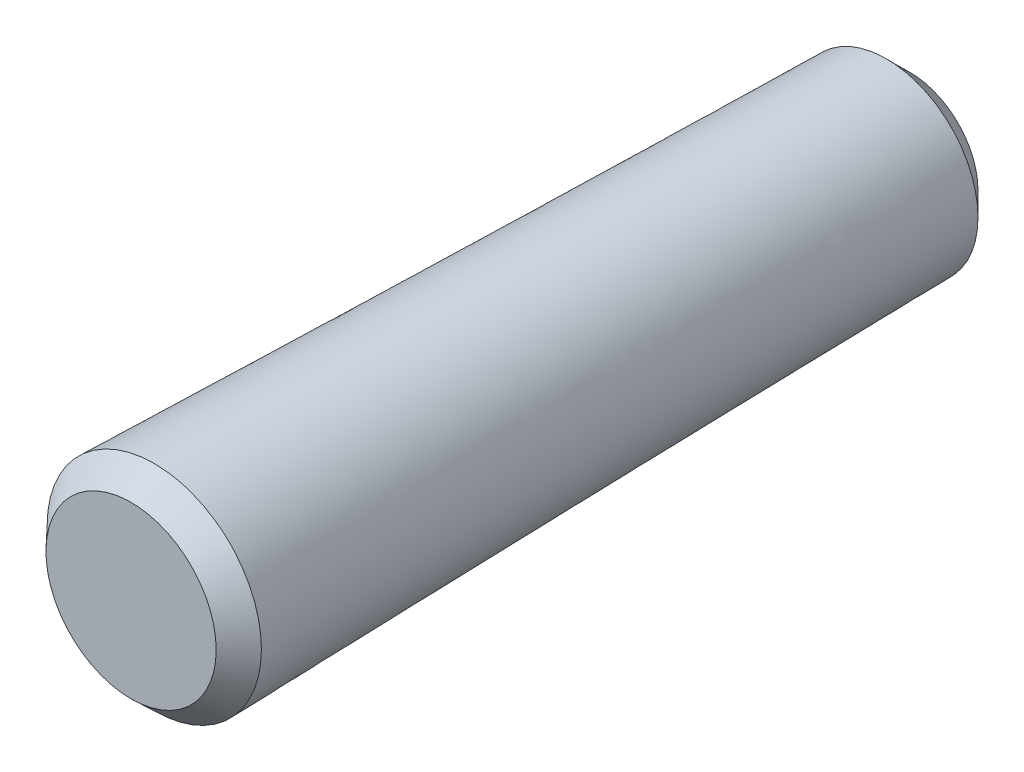
ISO-10303-21;
HEADER;
FILE_DESCRIPTION(('STEP AP214'),'2;1');
FILE_NAME('part.step','',(''),(''),'','','');
FILE_SCHEMA(('AUTOMOTIVE_DESIGN { 1 0 10303 214 1 1 1 1 }'));
ENDSEC;
DATA;
#1=APPLICATION_CONTEXT('core data for automotive mechanical design processes');
#2=APPLICATION_PROTOCOL_DEFINITION('international standard','automotive_design',2000,#1);
#3=PRODUCT_CONTEXT('',#1,'mechanical');
#4=PRODUCT('Part','Part','',(#3));
#5=PRODUCT_RELATED_PRODUCT_CATEGORY('part','',(#4));
#6=PRODUCT_DEFINITION_FORMATION('','',#4);
#7=PRODUCT_DEFINITION_CONTEXT('part definition',#1,'design');
#8=PRODUCT_DEFINITION('design','',#6,#7);
#9=PRODUCT_DEFINITION_SHAPE('','',#8);
#10=(LENGTH_UNIT() NAMED_UNIT(*) SI_UNIT(.MILLI.,.METRE.));
#11=(NAMED_UNIT(*) PLANE_ANGLE_UNIT() SI_UNIT($,.RADIAN.));
#12=(NAMED_UNIT(*) SI_UNIT($,.STERADIAN.) SOLID_ANGLE_UNIT());
#13=UNCERTAINTY_MEASURE_WITH_UNIT(LENGTH_MEASURE(1.E-05),#10,'distance_accuracy_value','');
#14=(GEOMETRIC_REPRESENTATION_CONTEXT(3) GLOBAL_UNCERTAINTY_ASSIGNED_CONTEXT((#13)) GLOBAL_UNIT_ASSIGNED_CONTEXT((#10,
#11,#12)) REPRESENTATION_CONTEXT('',''));
#15=CARTESIAN_POINT('',(0.,0.,0.));
#16=DIRECTION('',(0.,0.,1.));
#17=DIRECTION('',(1.,0.,0.));
#18=AXIS2_PLACEMENT_3D('',#15,#16,#17);
#19=CARTESIAN_POINT('',(0.,0.,23.5));
#20=DIRECTION('',(0.,0.,1.));
#21=DIRECTION('',(1.,0.,0.));
#22=AXIS2_PLACEMENT_3D('',#19,#20,#21);
#23=PLANE('',#22);
#24=CARTESIAN_POINT('',(0.,0.,23.5));
#25=DIRECTION('',(0.,0.,1.));
#26=DIRECTION('',(1.,0.,0.));
#27=AXIS2_PLACEMENT_3D('',#24,#25,#26);
#28=CIRCLE('',#27,2.56769376136639);
#29=CARTESIAN_POINT('',(2.56769376136639,0.,23.5));
#30=VERTEX_POINT('',#29);
#31=EDGE_CURVE('E48',#30,#30,#28,.T.);
#32=ORIENTED_EDGE('',*,*,#31,.T.);
#33=EDGE_LOOP('',(#32));
#34=FACE_BOUND('',#33,.T.);
#35=ADVANCED_FACE('F33',(#34),#23,.T.);
#36=CARTESIAN_POINT('',(0.,0.,0.));
#37=DIRECTION('',(0.,0.,1.));
#38=DIRECTION('',(1.,0.,0.));
#39=AXIS2_PLACEMENT_3D('',#36,#37,#38);
#40=PLANE('',#39);
#41=CARTESIAN_POINT('',(0.,0.,0.));
#42=DIRECTION('',(0.,0.,1.));
#43=DIRECTION('',(1.,0.,0.));
#44=AXIS2_PLACEMENT_3D('',#41,#42,#43);
#45=CIRCLE('',#44,2.05);
#46=CARTESIAN_POINT('',(2.05,0.,0.));
#47=VERTEX_POINT('',#46);
#48=EDGE_CURVE('E11',#47,#47,#45,.F.);
#49=ORIENTED_EDGE('',*,*,#48,.T.);
#50=EDGE_LOOP('',(#49));
#51=FACE_BOUND('',#50,.T.);
#52=ADVANCED_FACE('F64',(#51),#40,.F.);
#53=CARTESIAN_POINT('',(-1.91376019062887,-1.97484731884877,0.));
#54=CARTESIAN_POINT('',(-1.48928349640854,-2.88869082238393,23.5));
#55=CARTESIAN_POINT('',(2.03593444706866,-5.8023677001065,0.));
#56=CARTESIAN_POINT('',(4.28809814835931,-5.86725781520102,23.5));
#57=CARTESIAN_POINT('',(5.86345482832639,-1.85267306240897,0.));
#58=CARTESIAN_POINT('',(7.2666651411764,-0.0898761704331572,23.5));
#59=CARTESIAN_POINT('',(1.91376019062887,1.97484731884877,0.));
#60=CARTESIAN_POINT('',(1.48928349640854,2.88869082238393,23.5));
#61=CARTESIAN_POINT('',(-2.03593444706866,5.8023677001065,0.));
#62=CARTESIAN_POINT('',(-4.28809814835931,5.86725781520102,23.5));
#63=CARTESIAN_POINT('',(-5.8634548283264,1.85267306240897,0.));
#64=CARTESIAN_POINT('',(-7.2666651411764,0.0898761704331585,23.5));
#65=CARTESIAN_POINT('',(-1.91376019062887,-1.97484731884877,0.));
#66=CARTESIAN_POINT('',(-1.48928349640854,-2.88869082238393,23.5));
#67=(BOUNDED_SURFACE() B_SPLINE_SURFACE(3,1,((#53,#54),(#55,#56),(#57,#58),(#59,#60),(#61,#62),
(#63,#64),(#65,#66)),.UNSPECIFIED.,.T.,.F.,.F.) B_SPLINE_SURFACE_WITH_KNOTS((4,3,4),(2,2),(0.,
0.5,1.),(0.,1.),.UNSPECIFIED.) GEOMETRIC_REPRESENTATION_ITEM() RATIONAL_B_SPLINE_SURFACE(((1.,
1.),(0.333333333333334,0.333333333333333),(0.333333333333334,0.333333333333333),(1.,1.),
(0.333333333333333,0.333333333333333),(0.333333333333333,0.333333333333333),(1.,1.))) REPRESENTATION_ITEM('') SURFACE());
#68=CARTESIAN_POINT('',(0.,0.,22.8001525418561));
#69=DIRECTION('',(0.,0.,1.));
#70=DIRECTION('',(1.,0.,0.));
#71=AXIS2_PLACEMENT_3D('',#68,#69,#70);
#72=CIRCLE('',#71,3.2316902887109);
#73=CARTESIAN_POINT('',(-1.50192472770605,-2.86147588395455,22.8001525418561));
#74=VERTEX_POINT('',#73);
#75=EDGE_CURVE('E40',#74,#74,#72,.F.);
#76=CARTESIAN_POINT('',(0.,0.,0.711065575568826));
#77=DIRECTION('',(0.,0.,1.));
#78=DIRECTION('',(1.,0.,0.));
#79=AXIS2_PLACEMENT_3D('',#76,#77,#78);
#80=CIRCLE('',#79,2.76106557556882);
#81=CARTESIAN_POINT('',(-1.90091632829307,-2.00249849573477,0.711065575568826));
#82=VERTEX_POINT('',#81);
#83=EDGE_CURVE('E44',#82,#82,#80,.T.);
#84=CARTESIAN_POINT('',(-1.50192472770605,-2.86147588395455,22.8001525418561));
#85=CARTESIAN_POINT('',(-1.50608089021217,-2.85252820282726,22.5700578859572));
#86=CARTESIAN_POINT('',(-1.51023705271828,-2.84358052169997,22.3399632300584));
#87=CARTESIAN_POINT('',(-1.51854937773051,-2.82568515944539,21.8797739182608));
#88=CARTESIAN_POINT('',(-1.52270554023663,-2.8167374783181,21.6496792623619));
#89=CARTESIAN_POINT('',(-1.53101786524885,-2.79884211606352,21.1894899505643));
#90=CARTESIAN_POINT('',(-1.53517402775497,-2.78989443493623,20.9593952946655));
#91=CARTESIAN_POINT('',(-1.5434863527672,-2.77199907268166,20.4992059828678));
#92=CARTESIAN_POINT('',(-1.54764251527331,-2.76305139155437,20.269111326969));
#93=CARTESIAN_POINT('',(-1.55595484028554,-2.74515602929979,19.8089220151713));
#94=CARTESIAN_POINT('',(-1.56011100279166,-2.7362083481725,19.5788273592725));
#95=CARTESIAN_POINT('',(-1.56842332780389,-2.71831298591792,19.1186380474749));
#96=CARTESIAN_POINT('',(-1.57257949031,-2.70936530479063,18.888543391576));
#97=CARTESIAN_POINT('',(-1.58089181532223,-2.69146994253605,18.4283540797784));
#98=CARTESIAN_POINT('',(-1.58504797782835,-2.68252226140876,18.1982594238796));
#99=CARTESIAN_POINT('',(-1.59336030284058,-2.66462689915418,17.7380701120819));
#100=CARTESIAN_POINT('',(-1.59751646534669,-2.65567921802689,17.5079754561831));
#101=CARTESIAN_POINT('',(-1.60582879035892,-2.63778385577232,17.0477861443854));
#102=CARTESIAN_POINT('',(-1.60998495286503,-2.62883617464503,16.8176914884866));
#103=CARTESIAN_POINT('',(-1.61829727787726,-2.61094081239045,16.357502176689));
#104=CARTESIAN_POINT('',(-1.62245344038338,-2.60199313126316,16.1274075207901));
#105=CARTESIAN_POINT('',(-1.63076576539561,-2.58409776900858,15.6672182089925));
#106=CARTESIAN_POINT('',(-1.63492192790172,-2.57515008788129,15.4371235530937));
#107=CARTESIAN_POINT('',(-1.64323425291395,-2.55725472562671,14.976934241296));
#108=CARTESIAN_POINT('',(-1.64739041542007,-2.54830704449942,14.7468395853972));
#109=CARTESIAN_POINT('',(-1.6557027404323,-2.53041168224484,14.2866502735995));
#110=CARTESIAN_POINT('',(-1.65985890293841,-2.52146400111755,14.0565556177007));
#111=CARTESIAN_POINT('',(-1.66817122795064,-2.50356863886297,13.5963663059031));
#112=CARTESIAN_POINT('',(-1.67232739045676,-2.49462095773568,13.3662716500042));
#113=CARTESIAN_POINT('',(-1.68063971546898,-2.47672559548111,12.9060823382066));
#114=CARTESIAN_POINT('',(-1.6847958779751,-2.46777791435382,12.6759876823077));
#115=CARTESIAN_POINT('',(-1.69310820298733,-2.44988255209924,12.2157983705101));
#116=CARTESIAN_POINT('',(-1.69726436549344,-2.44093487097195,11.9857037146113));
#117=CARTESIAN_POINT('',(-1.70557669050567,-2.42303950871737,11.5255144028136));
#118=CARTESIAN_POINT('',(-1.70973285301179,-2.41409182759008,11.2954197469148));
#119=CARTESIAN_POINT('',(-1.71804517802402,-2.3961964653355,10.8352304351171));
#120=CARTESIAN_POINT('',(-1.72220134053013,-2.38724878420821,10.6051357792183));
#121=CARTESIAN_POINT('',(-1.73051366554236,-2.36935342195363,10.1449464674207));
#122=CARTESIAN_POINT('',(-1.73466982804848,-2.36040574082634,9.91485181152185));
#123=CARTESIAN_POINT('',(-1.74298215306071,-2.34251037857177,9.4546624997242));
#124=CARTESIAN_POINT('',(-1.74713831556682,-2.33356269744448,9.22456784382537));
#125=CARTESIAN_POINT('',(-1.75545064057905,-2.3156673351899,8.76437853202772));
#126=CARTESIAN_POINT('',(-1.75960680308516,-2.30671965406261,8.53428387612889));
#127=CARTESIAN_POINT('',(-1.76791912809739,-2.28882429180803,8.07409456433124));
#128=CARTESIAN_POINT('',(-1.77207529060351,-2.27987661068074,7.84399990843242));
#129=CARTESIAN_POINT('',(-1.78038761561574,-2.26198124842616,7.38381059663477));
#130=CARTESIAN_POINT('',(-1.78454377812185,-2.25303356729887,7.15371594073594));
#131=CARTESIAN_POINT('',(-1.79285610313408,-2.23513820504429,6.69352662893829));
#132=CARTESIAN_POINT('',(-1.7970122656402,-2.226190523917,6.46343197303946));
#133=CARTESIAN_POINT('',(-1.80532459065243,-2.20829516166242,6.00324266124181));
#134=CARTESIAN_POINT('',(-1.80948075315854,-2.19934748053514,5.77314800534299));
#135=CARTESIAN_POINT('',(-1.81779307817077,-2.18145211828056,5.31295869354534));
#136=CARTESIAN_POINT('',(-1.82194924067689,-2.17250443715327,5.08286403764651));
#137=CARTESIAN_POINT('',(-1.83026156568912,-2.15460907489869,4.62267472584886));
#138=CARTESIAN_POINT('',(-1.83441772819523,-2.1456613937714,4.39258006995003));
#139=CARTESIAN_POINT('',(-1.84273005320746,-2.12776603151682,3.93239075815238));
#140=CARTESIAN_POINT('',(-1.84688621571357,-2.11881835038953,3.70229610225356));
#141=CARTESIAN_POINT('',(-1.8551985407258,-2.10092298813495,3.24210679045591));
#142=CARTESIAN_POINT('',(-1.85935470323192,-2.09197530700766,3.01201213455708));
#143=CARTESIAN_POINT('',(-1.86766702824415,-2.07407994475308,2.55182282275943));
#144=CARTESIAN_POINT('',(-1.87182319075026,-2.06513226362579,2.3217281668606));
#145=CARTESIAN_POINT('',(-1.88013551576249,-2.04723690137122,1.86153885506295));
#146=CARTESIAN_POINT('',(-1.88429167826861,-2.03828922024393,1.63144419916413));
#147=CARTESIAN_POINT('',(-1.89260400328084,-2.02039385798935,1.17125488736648));
#148=CARTESIAN_POINT('',(-1.89676016578695,-2.01144617686206,0.941160231467652));
#149=CARTESIAN_POINT('',(-1.90091632829307,-2.00249849573477,0.711065575568827));
#150=B_SPLINE_CURVE_WITH_KNOTS('',3,(#84,#85,#86,#87,#88,#89,#90,#91,#92,#93,#94,#95,#96,#97,
#98,#99,#100,#101,#102,#103,#104,#105,#106,#107,#108,#109,#110,#111,#112,#113,#114,#115,#116,
#117,#118,#119,#120,#121,#122,#123,#124,#125,#126,#127,#128,#129,#130,#131,#132,#133,#134,#135,
#136,#137,#138,#139,#140,#141,#142,#143,#144,#145,#146,#147,#148,#149),.UNSPECIFIED.,.F.,.F.,(4,
2,2,2,2,2,2,2,2,2,2,2,2,2,2,2,2,2,2,2,2,2,2,2,2,2,2,2,2,2,2,2,4),(0.,0.690918206604649,
1.3818364132093,2.07275461981395,2.7636728264186,3.45459103302325,4.1455092396279,
4.83642744623255,5.5273456528372,6.21826385944185,6.9091820660465,7.60010027265115,
8.2910184792558,8.98193668586045,9.67285489246511,10.3637730990698,11.0546913056744,
11.7456095122791,12.4365277188837,13.1274459254884,13.818364132093,14.5092823386977,
15.2002005453023,15.891118751907,16.5820369585116,17.2729551651163,17.9638733717209,
18.6547915783256,19.3457097849302,20.0366279915348,20.7275461981395,21.4184644047441,
22.1093826113488),.UNSPECIFIED.);
#151=EDGE_CURVE('BSEAM57',#74,#82,#150,.T.);
#152=ORIENTED_EDGE('',*,*,#75,.T.);
#153=ORIENTED_EDGE('',*,*,#83,.T.);
#154=ORIENTED_EDGE('',*,*,#151,.T.);
#155=ORIENTED_EDGE('',*,*,#151,.F.);
#156=EDGE_LOOP('',(#152,#154,#153,#155));
#157=FACE_BOUND('',#156,.T.);
#158=ADVANCED_FACE('F57',(#157),#67,.T.);
#159=CARTESIAN_POINT('',(0.,0.,23.5));
#160=DIRECTION('',(0.,0.,-1.));
#161=DIRECTION('',(-1.,0.,0.));
#162=AXIS2_PLACEMENT_3D('',#159,#160,#161);
#163=CONICAL_SURFACE('',#162,2.56769376136639,0.759117535214909);
#164=ORIENTED_EDGE('',*,*,#75,.F.);
#165=EDGE_LOOP('',(#164));
#166=FACE_BOUND('',#165,.T.);
#167=ORIENTED_EDGE('',*,*,#31,.F.);
#168=EDGE_LOOP('',(#167));
#169=FACE_BOUND('',#168,.T.);
#170=ADVANCED_FACE('F55',(#166,#169),#163,.T.);
#171=CARTESIAN_POINT('',(0.,0.,0.711065575568826));
#172=DIRECTION('',(0.,0.,1.));
#173=DIRECTION('',(1.,0.,0.));
#174=AXIS2_PLACEMENT_3D('',#171,#172,#173);
#175=CONICAL_SURFACE('',#174,2.76106557556882,0.78539816339745);
#176=ORIENTED_EDGE('',*,*,#48,.F.);
#177=EDGE_LOOP('',(#176));
#178=FACE_BOUND('',#177,.T.);
#179=ORIENTED_EDGE('',*,*,#83,.F.);
#180=EDGE_LOOP('',(#179));
#181=FACE_BOUND('',#180,.T.);
#182=ADVANCED_FACE('F35',(#178,#181),#175,.T.);
#183=CLOSED_SHELL('',(#35,#52,#158,#170,#182));
#184=MANIFOLD_SOLID_BREP('B2',#183);
#185=ADVANCED_BREP_SHAPE_REPRESENTATION('',(#18,#184),#14);
#186=SHAPE_DEFINITION_REPRESENTATION(#9,#185);
ENDSEC;
END-ISO-10303-21;
